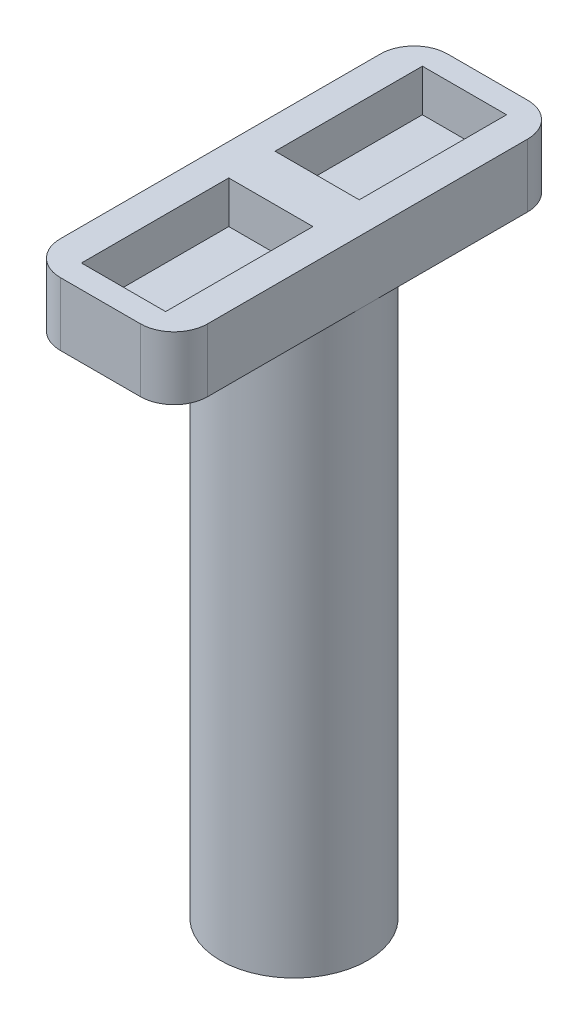
ISO-10303-21;
HEADER;
FILE_DESCRIPTION(('STEP AP214'),'2;1');
FILE_NAME('part.step','',(''),(''),'','','');
FILE_SCHEMA(('AUTOMOTIVE_DESIGN { 1 0 10303 214 1 1 1 1 }'));
ENDSEC;
DATA;
#1=APPLICATION_CONTEXT('core data for automotive mechanical design processes');
#2=APPLICATION_PROTOCOL_DEFINITION('international standard','automotive_design',2000,#1);
#3=PRODUCT_CONTEXT('',#1,'mechanical');
#4=PRODUCT('Part','Part','',(#3));
#5=PRODUCT_RELATED_PRODUCT_CATEGORY('part','',(#4));
#6=PRODUCT_DEFINITION_FORMATION('','',#4);
#7=PRODUCT_DEFINITION_CONTEXT('part definition',#1,'design');
#8=PRODUCT_DEFINITION('design','',#6,#7);
#9=PRODUCT_DEFINITION_SHAPE('','',#8);
#10=(LENGTH_UNIT() NAMED_UNIT(*) SI_UNIT(.MILLI.,.METRE.));
#11=(NAMED_UNIT(*) PLANE_ANGLE_UNIT() SI_UNIT($,.RADIAN.));
#12=(NAMED_UNIT(*) SI_UNIT($,.STERADIAN.) SOLID_ANGLE_UNIT());
#13=UNCERTAINTY_MEASURE_WITH_UNIT(LENGTH_MEASURE(1.E-05),#10,'distance_accuracy_value','');
#14=(GEOMETRIC_REPRESENTATION_CONTEXT(3) GLOBAL_UNCERTAINTY_ASSIGNED_CONTEXT((#13)) GLOBAL_UNIT_ASSIGNED_CONTEXT((#10,
#11,#12)) REPRESENTATION_CONTEXT('',''));
#15=CARTESIAN_POINT('',(0.,0.,0.));
#16=DIRECTION('',(0.,0.,1.));
#17=DIRECTION('',(1.,0.,0.));
#18=AXIS2_PLACEMENT_3D('',#15,#16,#17);
#19=CARTESIAN_POINT('',(0.,150.,0.));
#20=DIRECTION('',(0.,-1.,0.));
#21=DIRECTION('',(0.,0.,-1.));
#22=AXIS2_PLACEMENT_3D('',#19,#20,#21);
#23=CYLINDRICAL_SURFACE('',#22,17.5);
#24=CARTESIAN_POINT('',(0.,0.,0.));
#25=DIRECTION('',(0.,1.,0.));
#26=DIRECTION('',(0.,0.,1.));
#27=AXIS2_PLACEMENT_3D('',#24,#25,#26);
#28=CIRCLE('',#27,17.5);
#29=CARTESIAN_POINT('',(0.,0.,17.5));
#30=VERTEX_POINT('',#29);
#31=EDGE_CURVE('E293',#30,#30,#28,.T.);
#32=ORIENTED_EDGE('',*,*,#31,.T.);
#33=EDGE_LOOP('',(#32));
#34=FACE_BOUND('',#33,.T.);
#35=CARTESIAN_POINT('',(0.,135.,0.));
#36=DIRECTION('',(0.,1.,0.));
#37=DIRECTION('',(0.,0.,1.));
#38=AXIS2_PLACEMENT_3D('',#35,#36,#37);
#39=CIRCLE('',#38,17.5);
#40=CARTESIAN_POINT('',(17.5,135.,0.));
#41=VERTEX_POINT('',#40);
#42=CARTESIAN_POINT('',(-17.5,135.,0.));
#43=VERTEX_POINT('',#42);
#44=EDGE_CURVE('E301',#41,#43,#39,.T.);
#45=ORIENTED_EDGE('',*,*,#44,.F.);
#46=EDGE_CURVE('E297',#43,#41,#39,.T.);
#47=ORIENTED_EDGE('',*,*,#46,.F.);
#48=EDGE_LOOP('',(#45,#47));
#49=FACE_BOUND('',#48,.T.);
#50=ADVANCED_FACE('F43',(#34,#49),#23,.T.);
#51=CARTESIAN_POINT('',(0.,0.,0.));
#52=DIRECTION('',(0.,1.,0.));
#53=DIRECTION('',(0.,0.,1.));
#54=AXIS2_PLACEMENT_3D('',#51,#52,#53);
#55=PLANE('',#54);
#56=ORIENTED_EDGE('',*,*,#31,.F.);
#57=EDGE_LOOP('',(#56));
#58=FACE_BOUND('',#57,.T.);
#59=ADVANCED_FACE('F392',(#58),#55,.F.);
#60=CARTESIAN_POINT('',(17.5,135.,46.));
#61=DIRECTION('',(0.,1.,0.));
#62=DIRECTION('',(0.,0.,1.));
#63=AXIS2_PLACEMENT_3D('',#60,#61,#62);
#64=PLANE('',#63);
#65=DIRECTION('',(0.,0.,-1.));
#66=VECTOR('',#65,1.);
#67=CARTESIAN_POINT('',(-17.5,135.,46.));
#68=LINE('',#67,#66);
#69=CARTESIAN_POINT('',(-17.5,135.,-38.));
#70=VERTEX_POINT('',#69);
#71=EDGE_CURVE('E289',#43,#70,#68,.T.);
#72=ORIENTED_EDGE('',*,*,#71,.T.);
#73=CARTESIAN_POINT('',(-9.50000000000001,135.,-38.));
#74=DIRECTION('',(0.,1.,0.));
#75=DIRECTION('',(0.,0.,1.));
#76=AXIS2_PLACEMENT_3D('',#73,#74,#75);
#77=CIRCLE('',#76,8.);
#78=CARTESIAN_POINT('',(-9.50000000000001,135.,-46.));
#79=VERTEX_POINT('',#78);
#80=EDGE_CURVE('E312',#70,#79,#77,.F.);
#81=ORIENTED_EDGE('',*,*,#80,.T.);
#82=DIRECTION('',(1.,0.,0.));
#83=VECTOR('',#82,1.);
#84=CARTESIAN_POINT('',(17.5,135.,-46.));
#85=LINE('',#84,#83);
#86=CARTESIAN_POINT('',(9.5,135.,-46.));
#87=VERTEX_POINT('',#86);
#88=EDGE_CURVE('E214',#79,#87,#85,.T.);
#89=ORIENTED_EDGE('',*,*,#88,.T.);
#90=CARTESIAN_POINT('',(9.5,135.,-38.));
#91=DIRECTION('',(0.,1.,0.));
#92=DIRECTION('',(0.,0.,1.));
#93=AXIS2_PLACEMENT_3D('',#90,#91,#92);
#94=CIRCLE('',#93,8.);
#95=CARTESIAN_POINT('',(17.5,135.,-38.));
#96=VERTEX_POINT('',#95);
#97=EDGE_CURVE('E309',#87,#96,#94,.F.);
#98=ORIENTED_EDGE('',*,*,#97,.T.);
#99=DIRECTION('',(0.,0.,-1.));
#100=VECTOR('',#99,1.);
#101=CARTESIAN_POINT('',(17.5,135.,46.));
#102=LINE('',#101,#100);
#103=EDGE_CURVE('E285',#41,#96,#102,.T.);
#104=ORIENTED_EDGE('',*,*,#103,.F.);
#105=ORIENTED_EDGE('',*,*,#44,.T.);
#106=EDGE_LOOP('',(#72,#81,#89,#98,#104,#105));
#107=FACE_BOUND('',#106,.T.);
#108=ADVANCED_FACE('F385',(#107),#64,.F.);
#109=CARTESIAN_POINT('',(-17.5,135.,46.));
#110=DIRECTION('',(1.,0.,0.));
#111=DIRECTION('',(0.,0.,-1.));
#112=AXIS2_PLACEMENT_3D('',#109,#110,#111);
#113=PLANE('',#112);
#114=DIRECTION('',(0.,0.,-1.));
#115=VECTOR('',#114,1.);
#116=CARTESIAN_POINT('',(-17.5,150.,46.));
#117=LINE('',#116,#115);
#118=CARTESIAN_POINT('',(-17.5,150.,38.));
#119=VERTEX_POINT('',#118);
#120=CARTESIAN_POINT('',(-17.5,150.,-38.));
#121=VERTEX_POINT('',#120);
#122=EDGE_CURVE('E271',#119,#121,#117,.T.);
#123=ORIENTED_EDGE('',*,*,#122,.T.);
#124=DIRECTION('',(0.,-1.,0.));
#125=VECTOR('',#124,1.);
#126=CARTESIAN_POINT('',(-17.5,135.,-38.));
#127=LINE('',#126,#125);
#128=EDGE_CURVE('E305',#121,#70,#127,.T.);
#129=ORIENTED_EDGE('',*,*,#128,.T.);
#130=ORIENTED_EDGE('',*,*,#71,.F.);
#131=CARTESIAN_POINT('',(-17.5,135.,38.));
#132=VERTEX_POINT('',#131);
#133=EDGE_CURVE('E290',#132,#43,#68,.T.);
#134=ORIENTED_EDGE('',*,*,#133,.F.);
#135=DIRECTION('',(0.,-1.,0.));
#136=VECTOR('',#135,1.);
#137=CARTESIAN_POINT('',(-17.5,135.,38.));
#138=LINE('',#137,#136);
#139=EDGE_CURVE('E302',#132,#119,#138,.F.);
#140=ORIENTED_EDGE('',*,*,#139,.T.);
#141=EDGE_LOOP('',(#123,#129,#130,#134,#140));
#142=FACE_BOUND('',#141,.T.);
#143=ADVANCED_FACE('F351',(#142),#113,.F.);
#144=CARTESIAN_POINT('',(17.5,150.,46.));
#145=DIRECTION('',(-1.,0.,0.));
#146=DIRECTION('',(0.,-1.,0.));
#147=AXIS2_PLACEMENT_3D('',#144,#145,#146);
#148=PLANE('',#147);
#149=ORIENTED_EDGE('',*,*,#103,.T.);
#150=DIRECTION('',(0.,1.,0.));
#151=VECTOR('',#150,1.);
#152=CARTESIAN_POINT('',(17.5,150.,-38.));
#153=LINE('',#152,#151);
#154=CARTESIAN_POINT('',(17.5,150.,-38.));
#155=VERTEX_POINT('',#154);
#156=EDGE_CURVE('E335',#96,#155,#153,.T.);
#157=ORIENTED_EDGE('',*,*,#156,.T.);
#158=DIRECTION('',(0.,0.,-1.));
#159=VECTOR('',#158,1.);
#160=CARTESIAN_POINT('',(17.5,150.,46.));
#161=LINE('',#160,#159);
#162=CARTESIAN_POINT('',(17.5,150.,38.));
#163=VERTEX_POINT('',#162);
#164=EDGE_CURVE('E281',#163,#155,#161,.T.);
#165=ORIENTED_EDGE('',*,*,#164,.F.);
#166=DIRECTION('',(0.,1.,0.));
#167=VECTOR('',#166,1.);
#168=CARTESIAN_POINT('',(17.5,150.,38.));
#169=LINE('',#168,#167);
#170=CARTESIAN_POINT('',(17.5,135.,38.));
#171=VERTEX_POINT('',#170);
#172=EDGE_CURVE('E332',#163,#171,#169,.F.);
#173=ORIENTED_EDGE('',*,*,#172,.T.);
#174=EDGE_CURVE('E286',#171,#41,#102,.T.);
#175=ORIENTED_EDGE('',*,*,#174,.T.);
#176=EDGE_LOOP('',(#149,#157,#165,#173,#175));
#177=FACE_BOUND('',#176,.T.);
#178=ADVANCED_FACE('F367',(#177),#148,.F.);
#179=ORIENTED_EDGE('',*,*,#174,.F.);
#180=CARTESIAN_POINT('',(9.5,135.,38.));
#181=DIRECTION('',(0.,1.,0.));
#182=DIRECTION('',(0.,0.,1.));
#183=AXIS2_PLACEMENT_3D('',#180,#181,#182);
#184=CIRCLE('',#183,8.);
#185=CARTESIAN_POINT('',(9.5,135.,46.));
#186=VERTEX_POINT('',#185);
#187=EDGE_CURVE('E11',#171,#186,#184,.F.);
#188=ORIENTED_EDGE('',*,*,#187,.T.);
#189=DIRECTION('',(1.,0.,0.));
#190=VECTOR('',#189,1.);
#191=CARTESIAN_POINT('',(17.5,135.,46.));
#192=LINE('',#191,#190);
#193=CARTESIAN_POINT('',(-9.50000000000001,135.,46.));
#194=VERTEX_POINT('',#193);
#195=EDGE_CURVE('E263',#194,#186,#192,.T.);
#196=ORIENTED_EDGE('',*,*,#195,.F.);
#197=CARTESIAN_POINT('',(-9.50000000000001,135.,38.));
#198=DIRECTION('',(0.,1.,0.));
#199=DIRECTION('',(0.,0.,1.));
#200=AXIS2_PLACEMENT_3D('',#197,#198,#199);
#201=CIRCLE('',#200,8.);
#202=EDGE_CURVE('E52',#194,#132,#201,.F.);
#203=ORIENTED_EDGE('',*,*,#202,.T.);
#204=ORIENTED_EDGE('',*,*,#133,.T.);
#205=ORIENTED_EDGE('',*,*,#46,.T.);
#206=EDGE_LOOP('',(#179,#188,#196,#203,#204,#205));
#207=FACE_BOUND('',#206,.T.);
#208=ADVANCED_FACE('F347',(#207),#64,.F.);
#209=CARTESIAN_POINT('',(0.,0.,46.));
#210=DIRECTION('',(0.,0.,-1.));
#211=DIRECTION('',(-1.,0.,0.));
#212=AXIS2_PLACEMENT_3D('',#209,#210,#211);
#213=PLANE('',#212);
#214=ORIENTED_EDGE('',*,*,#195,.T.);
#215=DIRECTION('',(0.,1.,0.));
#216=VECTOR('',#215,1.);
#217=CARTESIAN_POINT('',(9.49999999999997,0.,46.));
#218=LINE('',#217,#216);
#219=CARTESIAN_POINT('',(9.50000000000001,150.,46.));
#220=VERTEX_POINT('',#219);
#221=EDGE_CURVE('E342',#186,#220,#218,.T.);
#222=ORIENTED_EDGE('',*,*,#221,.T.);
#223=DIRECTION('',(-1.,0.,0.));
#224=VECTOR('',#223,1.);
#225=CARTESIAN_POINT('',(-17.5,150.,46.));
#226=LINE('',#225,#224);
#227=CARTESIAN_POINT('',(-9.50000000000001,150.,46.));
#228=VERTEX_POINT('',#227);
#229=EDGE_CURVE('E266',#220,#228,#226,.T.);
#230=ORIENTED_EDGE('',*,*,#229,.T.);
#231=DIRECTION('',(0.,-1.,0.));
#232=VECTOR('',#231,1.);
#233=CARTESIAN_POINT('',(-9.50000000000001,0.,46.));
#234=LINE('',#233,#232);
#235=EDGE_CURVE('E339',#228,#194,#234,.T.);
#236=ORIENTED_EDGE('',*,*,#235,.T.);
#237=EDGE_LOOP('',(#214,#222,#230,#236));
#238=FACE_BOUND('',#237,.T.);
#239=ADVANCED_FACE('F359',(#238),#213,.F.);
#240=CARTESIAN_POINT('',(0.,0.,-46.));
#241=DIRECTION('',(0.,0.,-1.));
#242=DIRECTION('',(-1.,0.,0.));
#243=AXIS2_PLACEMENT_3D('',#240,#241,#242);
#244=PLANE('',#243);
#245=ORIENTED_EDGE('',*,*,#88,.F.);
#246=DIRECTION('',(0.,-1.,0.));
#247=VECTOR('',#246,1.);
#248=CARTESIAN_POINT('',(-9.50000000000001,150.,-46.));
#249=LINE('',#248,#247);
#250=CARTESIAN_POINT('',(-9.50000000000001,150.,-46.));
#251=VERTEX_POINT('',#250);
#252=EDGE_CURVE('E318',#79,#251,#249,.F.);
#253=ORIENTED_EDGE('',*,*,#252,.T.);
#254=DIRECTION('',(-1.,0.,0.));
#255=VECTOR('',#254,1.);
#256=CARTESIAN_POINT('',(-17.5,150.,-46.));
#257=LINE('',#256,#255);
#258=CARTESIAN_POINT('',(9.50000000000001,150.,-46.));
#259=VERTEX_POINT('',#258);
#260=EDGE_CURVE('E267',#259,#251,#257,.T.);
#261=ORIENTED_EDGE('',*,*,#260,.F.);
#262=DIRECTION('',(0.,1.,0.));
#263=VECTOR('',#262,1.);
#264=CARTESIAN_POINT('',(9.5,135.,-46.));
#265=LINE('',#264,#263);
#266=EDGE_CURVE('E315',#259,#87,#265,.F.);
#267=ORIENTED_EDGE('',*,*,#266,.T.);
#268=EDGE_LOOP('',(#245,#253,#261,#267));
#269=FACE_BOUND('',#268,.T.);
#270=ADVANCED_FACE('F378',(#269),#244,.T.);
#271=CARTESIAN_POINT('',(0.,150.,0.));
#272=DIRECTION('',(0.,1.,0.));
#273=DIRECTION('',(0.,0.,1.));
#274=AXIS2_PLACEMENT_3D('',#271,#272,#273);
#275=PLANE('',#274);
#276=DIRECTION('',(0.,0.,1.));
#277=VECTOR('',#276,1.);
#278=CARTESIAN_POINT('',(-10.,150.,-40.5));
#279=LINE('',#278,#277);
#280=CARTESIAN_POINT('',(-10.,150.,-40.5));
#281=VERTEX_POINT('',#280);
#282=CARTESIAN_POINT('',(-9.99999999999999,150.,-5.50000000000002));
#283=VERTEX_POINT('',#282);
#284=EDGE_CURVE('E170',#281,#283,#279,.T.);
#285=ORIENTED_EDGE('',*,*,#284,.F.);
#286=DIRECTION('',(-1.,0.,0.));
#287=VECTOR('',#286,1.);
#288=CARTESIAN_POINT('',(-10.,150.,-40.5));
#289=LINE('',#288,#287);
#290=CARTESIAN_POINT('',(10.,150.,-40.5));
#291=VERTEX_POINT('',#290);
#292=EDGE_CURVE('E190',#291,#281,#289,.T.);
#293=ORIENTED_EDGE('',*,*,#292,.F.);
#294=DIRECTION('',(0.,0.,-1.));
#295=VECTOR('',#294,1.);
#296=CARTESIAN_POINT('',(10.,150.,-40.5));
#297=LINE('',#296,#295);
#298=CARTESIAN_POINT('',(10.,150.,-5.50000000000002));
#299=VERTEX_POINT('',#298);
#300=EDGE_CURVE('E196',#299,#291,#297,.T.);
#301=ORIENTED_EDGE('',*,*,#300,.F.);
#302=DIRECTION('',(1.,0.,0.));
#303=VECTOR('',#302,1.);
#304=CARTESIAN_POINT('',(-9.99999999999999,150.,-5.50000000000002));
#305=LINE('',#304,#303);
#306=EDGE_CURVE('E205',#283,#299,#305,.T.);
#307=ORIENTED_EDGE('',*,*,#306,.F.);
#308=EDGE_LOOP('',(#285,#293,#301,#307));
#309=FACE_BOUND('',#308,.T.);
#310=DIRECTION('',(1.,0.,0.));
#311=VECTOR('',#310,1.);
#312=CARTESIAN_POINT('',(-10.,150.,40.5));
#313=LINE('',#312,#311);
#314=CARTESIAN_POINT('',(-10.,150.,40.5));
#315=VERTEX_POINT('',#314);
#316=CARTESIAN_POINT('',(10.,150.,40.5));
#317=VERTEX_POINT('',#316);
#318=EDGE_CURVE('E206',#315,#317,#313,.T.);
#319=ORIENTED_EDGE('',*,*,#318,.F.);
#320=DIRECTION('',(0.,0.,1.));
#321=VECTOR('',#320,1.);
#322=CARTESIAN_POINT('',(-10.,150.,40.5));
#323=LINE('',#322,#321);
#324=CARTESIAN_POINT('',(-9.99999999999999,150.,5.50000000000002));
#325=VERTEX_POINT('',#324);
#326=EDGE_CURVE('E234',#325,#315,#323,.T.);
#327=ORIENTED_EDGE('',*,*,#326,.F.);
#328=DIRECTION('',(-1.,0.,0.));
#329=VECTOR('',#328,1.);
#330=CARTESIAN_POINT('',(-9.99999999999999,150.,5.50000000000002));
#331=LINE('',#330,#329);
#332=CARTESIAN_POINT('',(10.,150.,5.50000000000002));
#333=VERTEX_POINT('',#332);
#334=EDGE_CURVE('E238',#333,#325,#331,.T.);
#335=ORIENTED_EDGE('',*,*,#334,.F.);
#336=DIRECTION('',(0.,0.,-1.));
#337=VECTOR('',#336,1.);
#338=CARTESIAN_POINT('',(10.,150.,40.5));
#339=LINE('',#338,#337);
#340=EDGE_CURVE('E243',#317,#333,#339,.T.);
#341=ORIENTED_EDGE('',*,*,#340,.F.);
#342=EDGE_LOOP('',(#319,#327,#335,#341));
#343=FACE_BOUND('',#342,.T.);
#344=ORIENTED_EDGE('',*,*,#260,.T.);
#345=CARTESIAN_POINT('',(-9.50000000000001,150.,-38.));
#346=DIRECTION('',(0.,1.,0.));
#347=DIRECTION('',(0.,0.,1.));
#348=AXIS2_PLACEMENT_3D('',#345,#346,#347);
#349=CIRCLE('',#348,8.);
#350=EDGE_CURVE('E330',#251,#121,#349,.T.);
#351=ORIENTED_EDGE('',*,*,#350,.T.);
#352=ORIENTED_EDGE('',*,*,#122,.F.);
#353=CARTESIAN_POINT('',(-9.50000000000001,150.,38.));
#354=DIRECTION('',(0.,1.,0.));
#355=DIRECTION('',(0.,0.,1.));
#356=AXIS2_PLACEMENT_3D('',#353,#354,#355);
#357=CIRCLE('',#356,8.);
#358=EDGE_CURVE('E321',#119,#228,#357,.T.);
#359=ORIENTED_EDGE('',*,*,#358,.T.);
#360=ORIENTED_EDGE('',*,*,#229,.F.);
#361=CARTESIAN_POINT('',(9.50000000000001,150.,38.));
#362=DIRECTION('',(0.,1.,0.));
#363=DIRECTION('',(0.,0.,1.));
#364=AXIS2_PLACEMENT_3D('',#361,#362,#363);
#365=CIRCLE('',#364,8.);
#366=EDGE_CURVE('E324',#220,#163,#365,.T.);
#367=ORIENTED_EDGE('',*,*,#366,.T.);
#368=ORIENTED_EDGE('',*,*,#164,.T.);
#369=CARTESIAN_POINT('',(9.50000000000001,150.,-38.));
#370=DIRECTION('',(0.,1.,0.));
#371=DIRECTION('',(0.,0.,1.));
#372=AXIS2_PLACEMENT_3D('',#369,#370,#371);
#373=CIRCLE('',#372,8.);
#374=EDGE_CURVE('E327',#155,#259,#373,.T.);
#375=ORIENTED_EDGE('',*,*,#374,.T.);
#376=EDGE_LOOP('',(#344,#351,#352,#359,#360,#367,#368,#375));
#377=FACE_BOUND('',#376,.T.);
#378=ADVANCED_FACE('F357',(#309,#343,#377),#275,.T.);
#379=CARTESIAN_POINT('',(-10.,140.,40.5));
#380=DIRECTION('',(0.,0.,1.));
#381=DIRECTION('',(1.,0.,0.));
#382=AXIS2_PLACEMENT_3D('',#379,#380,#381);
#383=PLANE('',#382);
#384=ORIENTED_EDGE('',*,*,#318,.T.);
#385=DIRECTION('',(0.,1.,0.));
#386=VECTOR('',#385,1.);
#387=CARTESIAN_POINT('',(10.,140.,40.5));
#388=LINE('',#387,#386);
#389=CARTESIAN_POINT('',(10.,140.,40.5));
#390=VERTEX_POINT('',#389);
#391=EDGE_CURVE('E220',#390,#317,#388,.T.);
#392=ORIENTED_EDGE('',*,*,#391,.F.);
#393=DIRECTION('',(1.,0.,0.));
#394=VECTOR('',#393,1.);
#395=CARTESIAN_POINT('',(-10.,140.,40.5));
#396=LINE('',#395,#394);
#397=CARTESIAN_POINT('',(-10.,140.,40.5));
#398=VERTEX_POINT('',#397);
#399=EDGE_CURVE('E239',#398,#390,#396,.T.);
#400=ORIENTED_EDGE('',*,*,#399,.F.);
#401=DIRECTION('',(0.,1.,0.));
#402=VECTOR('',#401,1.);
#403=CARTESIAN_POINT('',(-10.,140.,40.5));
#404=LINE('',#403,#402);
#405=EDGE_CURVE('E231',#398,#315,#404,.T.);
#406=ORIENTED_EDGE('',*,*,#405,.T.);
#407=EDGE_LOOP('',(#384,#392,#400,#406));
#408=FACE_BOUND('',#407,.T.);
#409=ADVANCED_FACE('F437',(#408),#383,.F.);
#410=CARTESIAN_POINT('',(-10.,140.,40.5));
#411=DIRECTION('',(-1.,0.,0.));
#412=DIRECTION('',(0.,0.,1.));
#413=AXIS2_PLACEMENT_3D('',#410,#411,#412);
#414=PLANE('',#413);
#415=ORIENTED_EDGE('',*,*,#326,.T.);
#416=ORIENTED_EDGE('',*,*,#405,.F.);
#417=DIRECTION('',(0.,0.,1.));
#418=VECTOR('',#417,1.);
#419=CARTESIAN_POINT('',(-10.,140.,40.5));
#420=LINE('',#419,#418);
#421=CARTESIAN_POINT('',(-9.99999999999999,140.,5.50000000000002));
#422=VERTEX_POINT('',#421);
#423=EDGE_CURVE('E224',#422,#398,#420,.T.);
#424=ORIENTED_EDGE('',*,*,#423,.F.);
#425=DIRECTION('',(0.,1.,0.));
#426=VECTOR('',#425,1.);
#427=CARTESIAN_POINT('',(-9.99999999999999,140.,5.50000000000002));
#428=LINE('',#427,#426);
#429=EDGE_CURVE('E228',#422,#325,#428,.T.);
#430=ORIENTED_EDGE('',*,*,#429,.T.);
#431=EDGE_LOOP('',(#415,#416,#424,#430));
#432=FACE_BOUND('',#431,.T.);
#433=ADVANCED_FACE('F559',(#432),#414,.F.);
#434=CARTESIAN_POINT('',(-9.99999999999999,140.,5.50000000000002));
#435=DIRECTION('',(0.,0.,-1.));
#436=DIRECTION('',(-1.,0.,0.));
#437=AXIS2_PLACEMENT_3D('',#434,#435,#436);
#438=PLANE('',#437);
#439=ORIENTED_EDGE('',*,*,#334,.T.);
#440=ORIENTED_EDGE('',*,*,#429,.F.);
#441=DIRECTION('',(-1.,0.,0.));
#442=VECTOR('',#441,1.);
#443=CARTESIAN_POINT('',(-9.99999999999999,140.,5.50000000000002));
#444=LINE('',#443,#442);
#445=CARTESIAN_POINT('',(10.,140.,5.50000000000002));
#446=VERTEX_POINT('',#445);
#447=EDGE_CURVE('E252',#446,#422,#444,.T.);
#448=ORIENTED_EDGE('',*,*,#447,.F.);
#449=DIRECTION('',(0.,1.,0.));
#450=VECTOR('',#449,1.);
#451=CARTESIAN_POINT('',(10.,140.,5.50000000000002));
#452=LINE('',#451,#450);
#453=EDGE_CURVE('E225',#446,#333,#452,.T.);
#454=ORIENTED_EDGE('',*,*,#453,.T.);
#455=EDGE_LOOP('',(#439,#440,#448,#454));
#456=FACE_BOUND('',#455,.T.);
#457=ADVANCED_FACE('F549',(#456),#438,.F.);
#458=CARTESIAN_POINT('',(10.,140.,40.5));
#459=DIRECTION('',(1.,0.,0.));
#460=DIRECTION('',(0.,0.,-1.));
#461=AXIS2_PLACEMENT_3D('',#458,#459,#460);
#462=PLANE('',#461);
#463=ORIENTED_EDGE('',*,*,#340,.T.);
#464=ORIENTED_EDGE('',*,*,#453,.F.);
#465=DIRECTION('',(0.,0.,-1.));
#466=VECTOR('',#465,1.);
#467=CARTESIAN_POINT('',(10.,140.,40.5));
#468=LINE('',#467,#466);
#469=EDGE_CURVE('E256',#390,#446,#468,.T.);
#470=ORIENTED_EDGE('',*,*,#469,.F.);
#471=ORIENTED_EDGE('',*,*,#391,.T.);
#472=EDGE_LOOP('',(#463,#464,#470,#471));
#473=FACE_BOUND('',#472,.T.);
#474=ADVANCED_FACE('F539',(#473),#462,.F.);
#475=CARTESIAN_POINT('',(0.,140.,0.));
#476=DIRECTION('',(0.,1.,0.));
#477=DIRECTION('',(0.,0.,1.));
#478=AXIS2_PLACEMENT_3D('',#475,#476,#477);
#479=PLANE('',#478);
#480=ORIENTED_EDGE('',*,*,#399,.T.);
#481=ORIENTED_EDGE('',*,*,#469,.T.);
#482=ORIENTED_EDGE('',*,*,#447,.T.);
#483=ORIENTED_EDGE('',*,*,#423,.T.);
#484=EDGE_LOOP('',(#480,#481,#482,#483));
#485=FACE_BOUND('',#484,.T.);
#486=ADVANCED_FACE('F530',(#485),#479,.T.);
#487=CARTESIAN_POINT('',(-10.,140.,-40.5));
#488=DIRECTION('',(-1.,0.,0.));
#489=DIRECTION('',(0.,0.,1.));
#490=AXIS2_PLACEMENT_3D('',#487,#488,#489);
#491=PLANE('',#490);
#492=ORIENTED_EDGE('',*,*,#284,.T.);
#493=DIRECTION('',(0.,1.,0.));
#494=VECTOR('',#493,1.);
#495=CARTESIAN_POINT('',(-9.99999999999999,140.,-5.50000000000002));
#496=LINE('',#495,#494);
#497=CARTESIAN_POINT('',(-9.99999999999999,140.,-5.50000000000002));
#498=VERTEX_POINT('',#497);
#499=EDGE_CURVE('E163',#498,#283,#496,.T.);
#500=ORIENTED_EDGE('',*,*,#499,.F.);
#501=DIRECTION('',(0.,0.,1.));
#502=VECTOR('',#501,1.);
#503=CARTESIAN_POINT('',(-10.,140.,-40.5));
#504=LINE('',#503,#502);
#505=CARTESIAN_POINT('',(-10.,140.,-40.5));
#506=VERTEX_POINT('',#505);
#507=EDGE_CURVE('E167',#506,#498,#504,.T.);
#508=ORIENTED_EDGE('',*,*,#507,.F.);
#509=DIRECTION('',(0.,1.,0.));
#510=VECTOR('',#509,1.);
#511=CARTESIAN_POINT('',(-10.,140.,-40.5));
#512=LINE('',#511,#510);
#513=EDGE_CURVE('E211',#506,#281,#512,.T.);
#514=ORIENTED_EDGE('',*,*,#513,.T.);
#515=EDGE_LOOP('',(#492,#500,#508,#514));
#516=FACE_BOUND('',#515,.T.);
#517=ADVANCED_FACE('F165',(#516),#491,.F.);
#518=CARTESIAN_POINT('',(-10.,140.,-40.5));
#519=DIRECTION('',(0.,0.,-1.));
#520=DIRECTION('',(-1.,0.,0.));
#521=AXIS2_PLACEMENT_3D('',#518,#519,#520);
#522=PLANE('',#521);
#523=ORIENTED_EDGE('',*,*,#292,.T.);
#524=ORIENTED_EDGE('',*,*,#513,.F.);
#525=DIRECTION('',(-1.,0.,0.));
#526=VECTOR('',#525,1.);
#527=CARTESIAN_POINT('',(-10.,140.,-40.5));
#528=LINE('',#527,#526);
#529=CARTESIAN_POINT('',(10.,140.,-40.5));
#530=VERTEX_POINT('',#529);
#531=EDGE_CURVE('E176',#530,#506,#528,.T.);
#532=ORIENTED_EDGE('',*,*,#531,.F.);
#533=DIRECTION('',(0.,1.,0.));
#534=VECTOR('',#533,1.);
#535=CARTESIAN_POINT('',(10.,140.,-40.5));
#536=LINE('',#535,#534);
#537=EDGE_CURVE('E215',#530,#291,#536,.T.);
#538=ORIENTED_EDGE('',*,*,#537,.T.);
#539=EDGE_LOOP('',(#523,#524,#532,#538));
#540=FACE_BOUND('',#539,.T.);
#541=ADVANCED_FACE('F511',(#540),#522,.F.);
#542=CARTESIAN_POINT('',(10.,140.,-40.5));
#543=DIRECTION('',(1.,0.,0.));
#544=DIRECTION('',(0.,0.,-1.));
#545=AXIS2_PLACEMENT_3D('',#542,#543,#544);
#546=PLANE('',#545);
#547=ORIENTED_EDGE('',*,*,#300,.T.);
#548=ORIENTED_EDGE('',*,*,#537,.F.);
#549=DIRECTION('',(0.,0.,-1.));
#550=VECTOR('',#549,1.);
#551=CARTESIAN_POINT('',(10.,140.,-40.5));
#552=LINE('',#551,#550);
#553=CARTESIAN_POINT('',(10.,140.,-5.50000000000002));
#554=VERTEX_POINT('',#553);
#555=EDGE_CURVE('E185',#554,#530,#552,.T.);
#556=ORIENTED_EDGE('',*,*,#555,.F.);
#557=DIRECTION('',(0.,1.,0.));
#558=VECTOR('',#557,1.);
#559=CARTESIAN_POINT('',(10.,140.,-5.50000000000002));
#560=LINE('',#559,#558);
#561=EDGE_CURVE('E175',#554,#299,#560,.T.);
#562=ORIENTED_EDGE('',*,*,#561,.T.);
#563=EDGE_LOOP('',(#547,#548,#556,#562));
#564=FACE_BOUND('',#563,.T.);
#565=ADVANCED_FACE('F502',(#564),#546,.F.);
#566=CARTESIAN_POINT('',(-9.99999999999999,140.,-5.50000000000002));
#567=DIRECTION('',(0.,0.,1.));
#568=DIRECTION('',(1.,0.,0.));
#569=AXIS2_PLACEMENT_3D('',#566,#567,#568);
#570=PLANE('',#569);
#571=ORIENTED_EDGE('',*,*,#306,.T.);
#572=ORIENTED_EDGE('',*,*,#561,.F.);
#573=DIRECTION('',(1.,0.,0.));
#574=VECTOR('',#573,1.);
#575=CARTESIAN_POINT('',(-9.99999999999999,140.,-5.50000000000002));
#576=LINE('',#575,#574);
#577=EDGE_CURVE('E179',#498,#554,#576,.T.);
#578=ORIENTED_EDGE('',*,*,#577,.F.);
#579=ORIENTED_EDGE('',*,*,#499,.T.);
#580=EDGE_LOOP('',(#571,#572,#578,#579));
#581=FACE_BOUND('',#580,.T.);
#582=ADVANCED_FACE('F180',(#581),#570,.F.);
#583=CARTESIAN_POINT('',(0.,140.,0.));
#584=DIRECTION('',(0.,1.,0.));
#585=DIRECTION('',(0.,0.,1.));
#586=AXIS2_PLACEMENT_3D('',#583,#584,#585);
#587=PLANE('',#586);
#588=ORIENTED_EDGE('',*,*,#507,.T.);
#589=ORIENTED_EDGE('',*,*,#577,.T.);
#590=ORIENTED_EDGE('',*,*,#555,.T.);
#591=ORIENTED_EDGE('',*,*,#531,.T.);
#592=EDGE_LOOP('',(#588,#589,#590,#591));
#593=FACE_BOUND('',#592,.T.);
#594=ADVANCED_FACE('F187',(#593),#587,.T.);
#595=CARTESIAN_POINT('',(-9.50000000000001,135.,-38.));
#596=DIRECTION('',(0.,1.,0.));
#597=DIRECTION('',(0.,0.,1.));
#598=AXIS2_PLACEMENT_3D('',#595,#596,#597);
#599=CYLINDRICAL_SURFACE('',#598,8.);
#600=ORIENTED_EDGE('',*,*,#350,.F.);
#601=ORIENTED_EDGE('',*,*,#252,.F.);
#602=ORIENTED_EDGE('',*,*,#80,.F.);
#603=ORIENTED_EDGE('',*,*,#128,.F.);
#604=EDGE_LOOP('',(#600,#601,#602,#603));
#605=FACE_BOUND('',#604,.T.);
#606=ADVANCED_FACE('F381',(#605),#599,.T.);
#607=CARTESIAN_POINT('',(9.50000000000001,150.,-38.));
#608=DIRECTION('',(0.,-1.,0.));
#609=DIRECTION('',(1.,0.,0.));
#610=AXIS2_PLACEMENT_3D('',#607,#608,#609);
#611=CYLINDRICAL_SURFACE('',#610,8.);
#612=ORIENTED_EDGE('',*,*,#97,.F.);
#613=ORIENTED_EDGE('',*,*,#266,.F.);
#614=ORIENTED_EDGE('',*,*,#374,.F.);
#615=ORIENTED_EDGE('',*,*,#156,.F.);
#616=EDGE_LOOP('',(#612,#613,#614,#615));
#617=FACE_BOUND('',#616,.T.);
#618=ADVANCED_FACE('F372',(#617),#611,.T.);
#619=CARTESIAN_POINT('',(9.49999999999997,0.,38.));
#620=DIRECTION('',(0.,1.,0.));
#621=DIRECTION('',(-1.,0.,0.));
#622=AXIS2_PLACEMENT_3D('',#619,#620,#621);
#623=CYLINDRICAL_SURFACE('',#622,8.);
#624=ORIENTED_EDGE('',*,*,#187,.F.);
#625=ORIENTED_EDGE('',*,*,#172,.F.);
#626=ORIENTED_EDGE('',*,*,#366,.F.);
#627=ORIENTED_EDGE('',*,*,#221,.F.);
#628=EDGE_LOOP('',(#624,#625,#626,#627));
#629=FACE_BOUND('',#628,.T.);
#630=ADVANCED_FACE('F362',(#629),#623,.T.);
#631=CARTESIAN_POINT('',(-9.50000000000001,0.,38.));
#632=DIRECTION('',(0.,-1.,0.));
#633=DIRECTION('',(0.,0.,-1.));
#634=AXIS2_PLACEMENT_3D('',#631,#632,#633);
#635=CYLINDRICAL_SURFACE('',#634,8.);
#636=ORIENTED_EDGE('',*,*,#358,.F.);
#637=ORIENTED_EDGE('',*,*,#139,.F.);
#638=ORIENTED_EDGE('',*,*,#202,.F.);
#639=ORIENTED_EDGE('',*,*,#235,.F.);
#640=EDGE_LOOP('',(#636,#637,#638,#639));
#641=FACE_BOUND('',#640,.T.);
#642=ADVANCED_FACE('F45',(#641),#635,.T.);
#643=CLOSED_SHELL('',(#50,#59,#108,#143,#178,#208,#239,#270,#378,#409,#433,#457,#474,#486,#517,
#541,#565,#582,#594,#606,#618,#630,#642));
#644=MANIFOLD_SOLID_BREP('B2',#643);
#645=ADVANCED_BREP_SHAPE_REPRESENTATION('',(#18,#644),#14);
#646=SHAPE_DEFINITION_REPRESENTATION(#9,#645);
ENDSEC;
END-ISO-10303-21;
